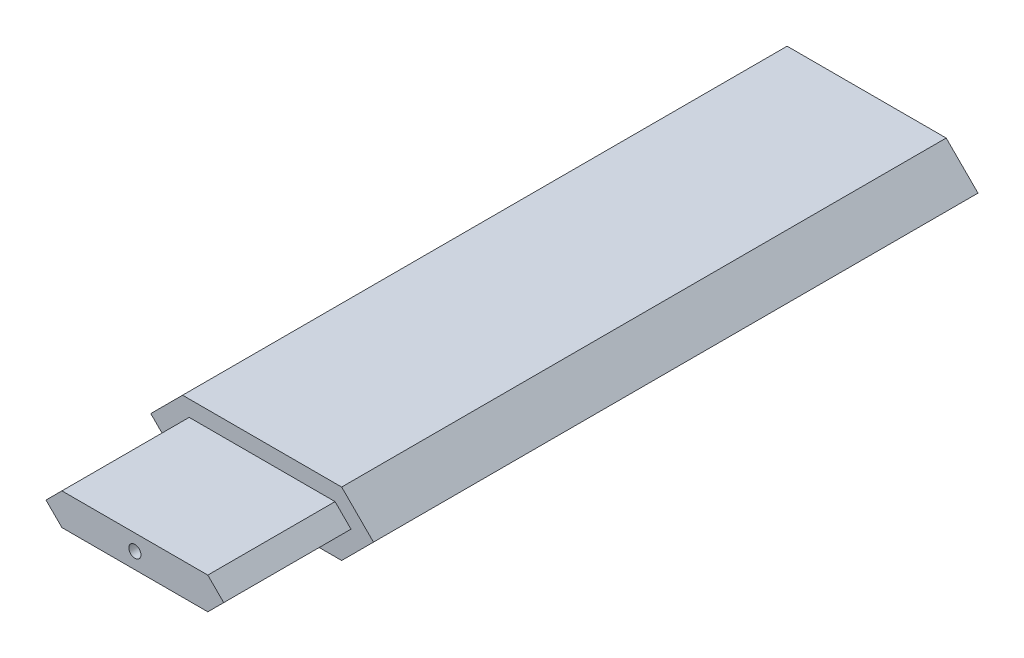
ISO-10303-21;
HEADER;
FILE_DESCRIPTION(('STEP AP214'),'2;1');
FILE_NAME('part.step','',(''),(''),'','','');
FILE_SCHEMA(('AUTOMOTIVE_DESIGN { 1 0 10303 214 1 1 1 1 }'));
ENDSEC;
DATA;
#1=APPLICATION_CONTEXT('core data for automotive mechanical design processes');
#2=APPLICATION_PROTOCOL_DEFINITION('international standard','automotive_design',2000,#1);
#3=PRODUCT_CONTEXT('',#1,'mechanical');
#4=PRODUCT('Part','Part','',(#3));
#5=PRODUCT_RELATED_PRODUCT_CATEGORY('part','',(#4));
#6=PRODUCT_DEFINITION_FORMATION('','',#4);
#7=PRODUCT_DEFINITION_CONTEXT('part definition',#1,'design');
#8=PRODUCT_DEFINITION('design','',#6,#7);
#9=PRODUCT_DEFINITION_SHAPE('','',#8);
#10=(LENGTH_UNIT() NAMED_UNIT(*) SI_UNIT(.MILLI.,.METRE.));
#11=(NAMED_UNIT(*) PLANE_ANGLE_UNIT() SI_UNIT($,.RADIAN.));
#12=(NAMED_UNIT(*) SI_UNIT($,.STERADIAN.) SOLID_ANGLE_UNIT());
#13=UNCERTAINTY_MEASURE_WITH_UNIT(LENGTH_MEASURE(1.E-05),#10,'distance_accuracy_value','');
#14=(GEOMETRIC_REPRESENTATION_CONTEXT(3) GLOBAL_UNCERTAINTY_ASSIGNED_CONTEXT((#13)) GLOBAL_UNIT_ASSIGNED_CONTEXT((#10,
#11,#12)) REPRESENTATION_CONTEXT('',''));
#15=CARTESIAN_POINT('',(0.,0.,0.));
#16=DIRECTION('',(0.,0.,1.));
#17=DIRECTION('',(1.,0.,0.));
#18=AXIS2_PLACEMENT_3D('',#15,#16,#17);
#19=CARTESIAN_POINT('',(0.,0.,-575.0001));
#20=DIRECTION('',(0.,0.,1.));
#21=DIRECTION('',(1.,0.,0.));
#22=AXIS2_PLACEMENT_3D('',#19,#20,#21);
#23=CYLINDRICAL_SURFACE('',#22,1.9);
#24=CARTESIAN_POINT('',(0.,0.,-345.));
#25=DIRECTION('',(0.,0.,1.));
#26=DIRECTION('',(1.,0.,0.));
#27=AXIS2_PLACEMENT_3D('',#24,#25,#26);
#28=CIRCLE('',#27,1.9);
#29=CARTESIAN_POINT('',(1.9,0.,-345.));
#30=VERTEX_POINT('',#29);
#31=EDGE_CURVE('E367',#30,#30,#28,.T.);
#32=ORIENTED_EDGE('',*,*,#31,.T.);
#33=EDGE_LOOP('',(#32));
#34=FACE_BOUND('',#33,.T.);
#35=CARTESIAN_POINT('',(0.,0.,-534.));
#36=DIRECTION('',(0.,0.,-1.));
#37=DIRECTION('',(-1.,0.,0.));
#38=AXIS2_PLACEMENT_3D('',#35,#36,#37);
#39=CIRCLE('',#38,1.9);
#40=CARTESIAN_POINT('',(-1.9,0.,-534.));
#41=VERTEX_POINT('',#40);
#42=EDGE_CURVE('E120',#41,#41,#39,.F.);
#43=ORIENTED_EDGE('',*,*,#42,.F.);
#44=EDGE_LOOP('',(#43));
#45=FACE_BOUND('',#44,.T.);
#46=ADVANCED_FACE('F115',(#34,#45),#23,.F.);
#47=CARTESIAN_POINT('',(17.5,-17.5,0.));
#48=DIRECTION('',(0.707106781186548,-0.707106781186547,0.));
#49=DIRECTION('',(-0.707106781186547,-0.707106781186548,0.));
#50=AXIS2_PLACEMENT_3D('',#47,#48,#49);
#51=PLANE('',#50);
#52=DIRECTION('',(0.,0.,-1.));
#53=VECTOR('',#52,1.);
#54=CARTESIAN_POINT('',(35.,0.,0.));
#55=LINE('',#54,#53);
#56=CARTESIAN_POINT('',(35.,0.,-385.));
#57=VERTEX_POINT('',#56);
#58=CARTESIAN_POINT('',(35.,0.,-575.));
#59=VERTEX_POINT('',#58);
#60=EDGE_CURVE('E484',#57,#59,#55,.T.);
#61=ORIENTED_EDGE('',*,*,#60,.F.);
#62=DIRECTION('',(-0.707106781186547,-0.707106781186548,0.));
#63=VECTOR('',#62,1.);
#64=CARTESIAN_POINT('',(17.5,-17.5,-385.));
#65=LINE('',#64,#63);
#66=CARTESIAN_POINT('',(25.,-10.,-385.));
#67=VERTEX_POINT('',#66);
#68=EDGE_CURVE('E357',#57,#67,#65,.T.);
#69=ORIENTED_EDGE('',*,*,#68,.T.);
#70=CARTESIAN_POINT('',(25.,-10.,-385.));
#71=DIRECTION('',(0.,0.,-1.));
#72=VECTOR('',#71,1.);
#73=LINE('',#70,#72);
#74=CARTESIAN_POINT('',(25.,-10.,-575.));
#75=VERTEX_POINT('',#74);
#76=EDGE_CURVE('E395',#67,#75,#73,.T.);
#77=ORIENTED_EDGE('',*,*,#76,.T.);
#78=DIRECTION('',(-0.707106781186547,-0.707106781186548,0.));
#79=VECTOR('',#78,1.);
#80=CARTESIAN_POINT('',(17.5,-17.5,-575.));
#81=LINE('',#80,#79);
#82=EDGE_CURVE('E385',#59,#75,#81,.T.);
#83=ORIENTED_EDGE('',*,*,#82,.F.);
#84=EDGE_LOOP('',(#61,#69,#77,#83));
#85=FACE_BOUND('',#84,.T.);
#86=ADVANCED_FACE('F417',(#85),#51,.T.);
#87=CARTESIAN_POINT('',(-17.5,-17.5,0.));
#88=DIRECTION('',(-0.707106781186548,-0.707106781186547,0.));
#89=DIRECTION('',(-0.707106781186547,0.707106781186548,0.));
#90=AXIS2_PLACEMENT_3D('',#87,#88,#89);
#91=PLANE('',#90);
#92=CARTESIAN_POINT('',(-25.,-10.,-575.));
#93=DIRECTION('',(0.,0.,1.));
#94=VECTOR('',#93,1.);
#95=LINE('',#92,#94);
#96=CARTESIAN_POINT('',(-25.,-10.,-575.));
#97=VERTEX_POINT('',#96);
#98=CARTESIAN_POINT('',(-25.,-10.,-385.));
#99=VERTEX_POINT('',#98);
#100=EDGE_CURVE('E494',#97,#99,#95,.T.);
#101=ORIENTED_EDGE('',*,*,#100,.T.);
#102=DIRECTION('',(-0.707106781186547,0.707106781186548,0.));
#103=VECTOR('',#102,1.);
#104=CARTESIAN_POINT('',(-17.5,-17.5,-385.));
#105=LINE('',#104,#103);
#106=CARTESIAN_POINT('',(-35.,0.,-385.));
#107=VERTEX_POINT('',#106);
#108=EDGE_CURVE('E352',#99,#107,#105,.T.);
#109=ORIENTED_EDGE('',*,*,#108,.T.);
#110=DIRECTION('',(0.,0.,1.));
#111=VECTOR('',#110,1.);
#112=CARTESIAN_POINT('',(-35.,0.,0.));
#113=LINE('',#112,#111);
#114=CARTESIAN_POINT('',(-35.,0.,-575.));
#115=VERTEX_POINT('',#114);
#116=EDGE_CURVE('E486',#115,#107,#113,.T.);
#117=ORIENTED_EDGE('',*,*,#116,.F.);
#118=DIRECTION('',(-0.707106781186547,0.707106781186548,0.));
#119=VECTOR('',#118,1.);
#120=CARTESIAN_POINT('',(-17.5,-17.5,-575.));
#121=LINE('',#120,#119);
#122=EDGE_CURVE('E380',#97,#115,#121,.T.);
#123=ORIENTED_EDGE('',*,*,#122,.F.);
#124=EDGE_LOOP('',(#101,#109,#117,#123));
#125=FACE_BOUND('',#124,.T.);
#126=ADVANCED_FACE('F407',(#125),#91,.T.);
#127=CARTESIAN_POINT('',(0.,-10.,0.));
#128=DIRECTION('',(0.,-1.,0.));
#129=DIRECTION('',(0.,0.,1.));
#130=AXIS2_PLACEMENT_3D('',#127,#128,#129);
#131=PLANE('',#130);
#132=ORIENTED_EDGE('',*,*,#76,.F.);
#133=DIRECTION('',(-1.,0.,0.));
#134=VECTOR('',#133,1.);
#135=CARTESIAN_POINT('',(0.,-10.,-385.));
#136=LINE('',#135,#134);
#137=EDGE_CURVE('E362',#67,#99,#136,.T.);
#138=ORIENTED_EDGE('',*,*,#137,.T.);
#139=ORIENTED_EDGE('',*,*,#100,.F.);
#140=DIRECTION('',(-1.,0.,0.));
#141=VECTOR('',#140,1.);
#142=CARTESIAN_POINT('',(0.,-10.,-575.));
#143=LINE('',#142,#141);
#144=EDGE_CURVE('E390',#75,#97,#143,.T.);
#145=ORIENTED_EDGE('',*,*,#144,.F.);
#146=EDGE_LOOP('',(#132,#138,#139,#145));
#147=FACE_BOUND('',#146,.T.);
#148=ADVANCED_FACE('F416',(#147),#131,.T.);
#149=CARTESIAN_POINT('',(-17.5,17.5,0.));
#150=DIRECTION('',(-0.707106781186548,0.707106781186547,0.));
#151=DIRECTION('',(-0.707106781186547,-0.707106781186548,0.));
#152=AXIS2_PLACEMENT_3D('',#149,#150,#151);
#153=PLANE('',#152);
#154=ORIENTED_EDGE('',*,*,#116,.T.);
#155=DIRECTION('',(0.707106781186547,0.707106781186548,0.));
#156=VECTOR('',#155,1.);
#157=CARTESIAN_POINT('',(-17.5,17.5,-385.));
#158=LINE('',#157,#156);
#159=CARTESIAN_POINT('',(-25.,10.,-385.));
#160=VERTEX_POINT('',#159);
#161=EDGE_CURVE('E347',#107,#160,#158,.T.);
#162=ORIENTED_EDGE('',*,*,#161,.T.);
#163=DIRECTION('',(0.,0.,1.));
#164=VECTOR('',#163,1.);
#165=CARTESIAN_POINT('',(-25.,10.,0.));
#166=LINE('',#165,#164);
#167=CARTESIAN_POINT('',(-25.,10.,-575.));
#168=VERTEX_POINT('',#167);
#169=EDGE_CURVE('E449',#168,#160,#166,.T.);
#170=ORIENTED_EDGE('',*,*,#169,.F.);
#171=DIRECTION('',(0.707106781186547,0.707106781186548,0.));
#172=VECTOR('',#171,1.);
#173=CARTESIAN_POINT('',(-17.5,17.5,-575.));
#174=LINE('',#173,#172);
#175=EDGE_CURVE('E375',#115,#168,#174,.T.);
#176=ORIENTED_EDGE('',*,*,#175,.F.);
#177=EDGE_LOOP('',(#154,#162,#170,#176));
#178=FACE_BOUND('',#177,.T.);
#179=ADVANCED_FACE('F117',(#178),#153,.T.);
#180=CARTESIAN_POINT('',(17.5,17.5,0.));
#181=DIRECTION('',(0.707106781186548,0.707106781186547,0.));
#182=DIRECTION('',(-0.707106781186547,0.707106781186548,0.));
#183=AXIS2_PLACEMENT_3D('',#180,#181,#182);
#184=PLANE('',#183);
#185=DIRECTION('',(0.,0.,-1.));
#186=VECTOR('',#185,1.);
#187=CARTESIAN_POINT('',(25.,10.,0.));
#188=LINE('',#187,#186);
#189=CARTESIAN_POINT('',(25.,10.,-385.));
#190=VERTEX_POINT('',#189);
#191=CARTESIAN_POINT('',(25.,10.,-575.));
#192=VERTEX_POINT('',#191);
#193=EDGE_CURVE('E479',#190,#192,#188,.T.);
#194=ORIENTED_EDGE('',*,*,#193,.F.);
#195=DIRECTION('',(0.707106781186547,-0.707106781186548,0.));
#196=VECTOR('',#195,1.);
#197=CARTESIAN_POINT('',(17.5,17.5,-385.));
#198=LINE('',#197,#196);
#199=EDGE_CURVE('E141',#190,#57,#198,.T.);
#200=ORIENTED_EDGE('',*,*,#199,.T.);
#201=ORIENTED_EDGE('',*,*,#60,.T.);
#202=DIRECTION('',(0.707106781186547,-0.707106781186548,0.));
#203=VECTOR('',#202,1.);
#204=CARTESIAN_POINT('',(17.5,17.5,-575.));
#205=LINE('',#204,#203);
#206=EDGE_CURVE('E372',#192,#59,#205,.T.);
#207=ORIENTED_EDGE('',*,*,#206,.F.);
#208=EDGE_LOOP('',(#194,#200,#201,#207));
#209=FACE_BOUND('',#208,.T.);
#210=ADVANCED_FACE('F425',(#209),#184,.T.);
#211=CARTESIAN_POINT('',(0.,10.,0.));
#212=DIRECTION('',(0.,1.,0.));
#213=DIRECTION('',(0.,0.,1.));
#214=AXIS2_PLACEMENT_3D('',#211,#212,#213);
#215=PLANE('',#214);
#216=ORIENTED_EDGE('',*,*,#169,.T.);
#217=DIRECTION('',(1.,0.,0.));
#218=VECTOR('',#217,1.);
#219=CARTESIAN_POINT('',(0.,10.,-385.));
#220=LINE('',#219,#218);
#221=EDGE_CURVE('E13',#160,#190,#220,.T.);
#222=ORIENTED_EDGE('',*,*,#221,.T.);
#223=ORIENTED_EDGE('',*,*,#193,.T.);
#224=DIRECTION('',(1.,0.,0.));
#225=VECTOR('',#224,1.);
#226=CARTESIAN_POINT('',(0.,10.,-575.));
#227=LINE('',#226,#225);
#228=EDGE_CURVE('E125',#168,#192,#227,.T.);
#229=ORIENTED_EDGE('',*,*,#228,.F.);
#230=EDGE_LOOP('',(#216,#222,#223,#229));
#231=FACE_BOUND('',#230,.T.);
#232=ADVANCED_FACE('F421',(#231),#215,.T.);
#233=CARTESIAN_POINT('',(0.,-22.5001,-345.));
#234=DIRECTION('',(0.,0.,1.));
#235=DIRECTION('',(1.,0.,0.));
#236=AXIS2_PLACEMENT_3D('',#233,#234,#235);
#237=PLANE('',#236);
#238=ORIENTED_EDGE('',*,*,#31,.F.);
#239=EDGE_LOOP('',(#238));
#240=FACE_BOUND('',#239,.T.);
#241=DIRECTION('',(-0.707106781186547,-0.707106781186548,0.));
#242=VECTOR('',#241,1.);
#243=CARTESIAN_POINT('',(-22.9289321881345,5.,-345.));
#244=LINE('',#243,#242);
#245=CARTESIAN_POINT('',(-22.9289321881345,5.,-345.));
#246=VERTEX_POINT('',#245);
#247=CARTESIAN_POINT('',(-27.9289321881345,0.,-345.));
#248=VERTEX_POINT('',#247);
#249=EDGE_CURVE('E301',#246,#248,#244,.T.);
#250=ORIENTED_EDGE('',*,*,#249,.T.);
#251=DIRECTION('',(0.707106781186548,-0.707106781186548,0.));
#252=VECTOR('',#251,1.);
#253=CARTESIAN_POINT('',(-27.9289321881345,0.,-345.));
#254=LINE('',#253,#252);
#255=CARTESIAN_POINT('',(-22.9289321881345,-5.,-345.));
#256=VERTEX_POINT('',#255);
#257=EDGE_CURVE('E317',#248,#256,#254,.T.);
#258=ORIENTED_EDGE('',*,*,#257,.T.);
#259=DIRECTION('',(1.,0.,0.));
#260=VECTOR('',#259,1.);
#261=CARTESIAN_POINT('',(-22.9289321881345,-5.,-345.));
#262=LINE('',#261,#260);
#263=CARTESIAN_POINT('',(22.9289321881345,-5.,-345.));
#264=VERTEX_POINT('',#263);
#265=EDGE_CURVE('E320',#256,#264,#262,.T.);
#266=ORIENTED_EDGE('',*,*,#265,.T.);
#267=DIRECTION('',(0.707106781186547,0.707106781186548,0.));
#268=VECTOR('',#267,1.);
#269=CARTESIAN_POINT('',(22.9289321881345,-5.,-345.));
#270=LINE('',#269,#268);
#271=CARTESIAN_POINT('',(27.9289321881345,0.,-345.));
#272=VERTEX_POINT('',#271);
#273=EDGE_CURVE('E323',#264,#272,#270,.T.);
#274=ORIENTED_EDGE('',*,*,#273,.T.);
#275=DIRECTION('',(-0.707106781186547,0.707106781186548,0.));
#276=VECTOR('',#275,1.);
#277=CARTESIAN_POINT('',(27.9289321881345,0.,-345.));
#278=LINE('',#277,#276);
#279=CARTESIAN_POINT('',(22.9289321881345,5.,-345.));
#280=VERTEX_POINT('',#279);
#281=EDGE_CURVE('E326',#272,#280,#278,.T.);
#282=ORIENTED_EDGE('',*,*,#281,.T.);
#283=DIRECTION('',(-1.,0.,0.));
#284=VECTOR('',#283,1.);
#285=CARTESIAN_POINT('',(22.9289321881345,5.,-345.));
#286=LINE('',#285,#284);
#287=EDGE_CURVE('E329',#280,#246,#286,.T.);
#288=ORIENTED_EDGE('',*,*,#287,.T.);
#289=EDGE_LOOP('',(#250,#258,#266,#274,#282,#288));
#290=FACE_BOUND('',#289,.T.);
#291=ADVANCED_FACE('F424',(#240,#290),#237,.T.);
#292=CARTESIAN_POINT('',(0.,-22.5001,-575.));
#293=DIRECTION('',(0.,0.,1.));
#294=DIRECTION('',(1.,0.,0.));
#295=AXIS2_PLACEMENT_3D('',#292,#293,#294);
#296=PLANE('',#295);
#297=DIRECTION('',(-0.707106781186547,-0.707106781186548,0.));
#298=VECTOR('',#297,1.);
#299=CARTESIAN_POINT('',(28.2117749006091,0.,-575.));
#300=LINE('',#299,#298);
#301=CARTESIAN_POINT('',(28.2117749006091,0.,-575.));
#302=VERTEX_POINT('',#301);
#303=CARTESIAN_POINT('',(23.0117749006092,-5.2,-575.));
#304=VERTEX_POINT('',#303);
#305=EDGE_CURVE('E278',#302,#304,#300,.T.);
#306=ORIENTED_EDGE('',*,*,#305,.F.);
#307=DIRECTION('',(0.707106781186547,-0.707106781186548,0.));
#308=VECTOR('',#307,1.);
#309=CARTESIAN_POINT('',(23.0117749006092,5.2,-575.));
#310=LINE('',#309,#308);
#311=CARTESIAN_POINT('',(23.0117749006092,5.2,-575.));
#312=VERTEX_POINT('',#311);
#313=EDGE_CURVE('E133',#312,#302,#310,.T.);
#314=ORIENTED_EDGE('',*,*,#313,.F.);
#315=DIRECTION('',(1.,0.,0.));
#316=VECTOR('',#315,1.);
#317=CARTESIAN_POINT('',(-23.0117749006092,5.2,-575.));
#318=LINE('',#317,#316);
#319=CARTESIAN_POINT('',(-23.0117749006092,5.2,-575.));
#320=VERTEX_POINT('',#319);
#321=EDGE_CURVE('E264',#320,#312,#318,.T.);
#322=ORIENTED_EDGE('',*,*,#321,.F.);
#323=DIRECTION('',(0.707106781186548,0.707106781186547,0.));
#324=VECTOR('',#323,1.);
#325=CARTESIAN_POINT('',(-28.2117749006092,0.,-575.));
#326=LINE('',#325,#324);
#327=CARTESIAN_POINT('',(-28.2117749006092,0.,-575.));
#328=VERTEX_POINT('',#327);
#329=EDGE_CURVE('E267',#328,#320,#326,.T.);
#330=ORIENTED_EDGE('',*,*,#329,.F.);
#331=DIRECTION('',(-0.707106781186548,0.707106781186548,0.));
#332=VECTOR('',#331,1.);
#333=CARTESIAN_POINT('',(-23.0117749006092,-5.2,-575.));
#334=LINE('',#333,#332);
#335=CARTESIAN_POINT('',(-23.0117749006092,-5.2,-575.));
#336=VERTEX_POINT('',#335);
#337=EDGE_CURVE('E283',#336,#328,#334,.T.);
#338=ORIENTED_EDGE('',*,*,#337,.F.);
#339=DIRECTION('',(-1.,0.,0.));
#340=VECTOR('',#339,1.);
#341=CARTESIAN_POINT('',(23.0117749006092,-5.2,-575.));
#342=LINE('',#341,#340);
#343=EDGE_CURVE('E280',#304,#336,#342,.T.);
#344=ORIENTED_EDGE('',*,*,#343,.F.);
#345=EDGE_LOOP('',(#306,#314,#322,#330,#338,#344));
#346=FACE_BOUND('',#345,.T.);
#347=ORIENTED_EDGE('',*,*,#82,.T.);
#348=ORIENTED_EDGE('',*,*,#144,.T.);
#349=ORIENTED_EDGE('',*,*,#122,.T.);
#350=ORIENTED_EDGE('',*,*,#175,.T.);
#351=ORIENTED_EDGE('',*,*,#228,.T.);
#352=ORIENTED_EDGE('',*,*,#206,.T.);
#353=EDGE_LOOP('',(#347,#348,#349,#350,#351,#352));
#354=FACE_BOUND('',#353,.T.);
#355=ADVANCED_FACE('F512',(#346,#354),#296,.F.);
#356=CARTESIAN_POINT('',(0.,0.,-385.));
#357=DIRECTION('',(0.,0.,1.));
#358=DIRECTION('',(1.,0.,0.));
#359=AXIS2_PLACEMENT_3D('',#356,#357,#358);
#360=PLANE('',#359);
#361=ORIENTED_EDGE('',*,*,#68,.F.);
#362=ORIENTED_EDGE('',*,*,#199,.F.);
#363=ORIENTED_EDGE('',*,*,#221,.F.);
#364=ORIENTED_EDGE('',*,*,#161,.F.);
#365=ORIENTED_EDGE('',*,*,#108,.F.);
#366=ORIENTED_EDGE('',*,*,#137,.F.);
#367=EDGE_LOOP('',(#361,#362,#363,#364,#365,#366));
#368=FACE_BOUND('',#367,.T.);
#369=DIRECTION('',(-0.707106781186547,-0.707106781186548,0.));
#370=VECTOR('',#369,1.);
#371=CARTESIAN_POINT('',(-22.9289321881345,5.,-385.));
#372=LINE('',#371,#370);
#373=CARTESIAN_POINT('',(-22.9289321881345,5.,-385.));
#374=VERTEX_POINT('',#373);
#375=CARTESIAN_POINT('',(-27.9289321881345,0.,-385.));
#376=VERTEX_POINT('',#375);
#377=EDGE_CURVE('E313',#374,#376,#372,.T.);
#378=ORIENTED_EDGE('',*,*,#377,.F.);
#379=DIRECTION('',(-1.,0.,0.));
#380=VECTOR('',#379,1.);
#381=CARTESIAN_POINT('',(22.9289321881345,5.,-385.));
#382=LINE('',#381,#380);
#383=CARTESIAN_POINT('',(22.9289321881345,5.,-385.));
#384=VERTEX_POINT('',#383);
#385=EDGE_CURVE('E310',#384,#374,#382,.T.);
#386=ORIENTED_EDGE('',*,*,#385,.F.);
#387=DIRECTION('',(-0.707106781186547,0.707106781186548,0.));
#388=VECTOR('',#387,1.);
#389=CARTESIAN_POINT('',(27.9289321881345,0.,-385.));
#390=LINE('',#389,#388);
#391=CARTESIAN_POINT('',(27.9289321881345,0.,-385.));
#392=VERTEX_POINT('',#391);
#393=EDGE_CURVE('E307',#392,#384,#390,.T.);
#394=ORIENTED_EDGE('',*,*,#393,.F.);
#395=DIRECTION('',(0.707106781186547,0.707106781186548,0.));
#396=VECTOR('',#395,1.);
#397=CARTESIAN_POINT('',(22.9289321881345,-5.,-385.));
#398=LINE('',#397,#396);
#399=CARTESIAN_POINT('',(22.9289321881345,-5.,-385.));
#400=VERTEX_POINT('',#399);
#401=EDGE_CURVE('E304',#400,#392,#398,.T.);
#402=ORIENTED_EDGE('',*,*,#401,.F.);
#403=DIRECTION('',(1.,0.,0.));
#404=VECTOR('',#403,1.);
#405=CARTESIAN_POINT('',(-22.9289321881345,-5.,-385.));
#406=LINE('',#405,#404);
#407=CARTESIAN_POINT('',(-22.9289321881345,-5.,-385.));
#408=VERTEX_POINT('',#407);
#409=EDGE_CURVE('E300',#408,#400,#406,.T.);
#410=ORIENTED_EDGE('',*,*,#409,.F.);
#411=DIRECTION('',(0.707106781186548,-0.707106781186548,0.));
#412=VECTOR('',#411,1.);
#413=CARTESIAN_POINT('',(-27.9289321881345,0.,-385.));
#414=LINE('',#413,#412);
#415=EDGE_CURVE('E297',#376,#408,#414,.T.);
#416=ORIENTED_EDGE('',*,*,#415,.F.);
#417=EDGE_LOOP('',(#378,#386,#394,#402,#410,#416));
#418=FACE_BOUND('',#417,.T.);
#419=ADVANCED_FACE('F516',(#368,#418),#360,.T.);
#420=CARTESIAN_POINT('',(-27.9289321881345,0.,-385.));
#421=DIRECTION('',(-0.707106781186548,-0.707106781186548,0.));
#422=DIRECTION('',(0.707106781186548,-0.707106781186548,0.));
#423=AXIS2_PLACEMENT_3D('',#420,#421,#422);
#424=PLANE('',#423);
#425=ORIENTED_EDGE('',*,*,#257,.F.);
#426=DIRECTION('',(0.,0.,1.));
#427=VECTOR('',#426,1.);
#428=CARTESIAN_POINT('',(-27.9289321881345,0.,-385.));
#429=LINE('',#428,#427);
#430=EDGE_CURVE('E334',#376,#248,#429,.T.);
#431=ORIENTED_EDGE('',*,*,#430,.F.);
#432=ORIENTED_EDGE('',*,*,#415,.T.);
#433=DIRECTION('',(0.,0.,1.));
#434=VECTOR('',#433,1.);
#435=CARTESIAN_POINT('',(-22.9289321881345,-5.,-385.));
#436=LINE('',#435,#434);
#437=EDGE_CURVE('E316',#408,#256,#436,.T.);
#438=ORIENTED_EDGE('',*,*,#437,.T.);
#439=EDGE_LOOP('',(#425,#431,#432,#438));
#440=FACE_BOUND('',#439,.T.);
#441=ADVANCED_FACE('F526',(#440),#424,.T.);
#442=CARTESIAN_POINT('',(-22.9289321881345,5.,-385.));
#443=DIRECTION('',(-0.707106781186548,0.707106781186547,0.));
#444=DIRECTION('',(-0.707106781186547,-0.707106781186548,0.));
#445=AXIS2_PLACEMENT_3D('',#442,#443,#444);
#446=PLANE('',#445);
#447=ORIENTED_EDGE('',*,*,#249,.F.);
#448=DIRECTION('',(0.,0.,1.));
#449=VECTOR('',#448,1.);
#450=CARTESIAN_POINT('',(-22.9289321881345,5.,-385.));
#451=LINE('',#450,#449);
#452=EDGE_CURVE('E336',#374,#246,#451,.T.);
#453=ORIENTED_EDGE('',*,*,#452,.F.);
#454=ORIENTED_EDGE('',*,*,#377,.T.);
#455=ORIENTED_EDGE('',*,*,#430,.T.);
#456=EDGE_LOOP('',(#447,#453,#454,#455));
#457=FACE_BOUND('',#456,.T.);
#458=ADVANCED_FACE('F529',(#457),#446,.T.);
#459=CARTESIAN_POINT('',(22.9289321881345,5.,-385.));
#460=DIRECTION('',(0.,1.,0.));
#461=DIRECTION('',(-1.,0.,0.));
#462=AXIS2_PLACEMENT_3D('',#459,#460,#461);
#463=PLANE('',#462);
#464=ORIENTED_EDGE('',*,*,#287,.F.);
#465=DIRECTION('',(0.,0.,1.));
#466=VECTOR('',#465,1.);
#467=CARTESIAN_POINT('',(22.9289321881345,5.,-385.));
#468=LINE('',#467,#466);
#469=EDGE_CURVE('E338',#384,#280,#468,.T.);
#470=ORIENTED_EDGE('',*,*,#469,.F.);
#471=ORIENTED_EDGE('',*,*,#385,.T.);
#472=ORIENTED_EDGE('',*,*,#452,.T.);
#473=EDGE_LOOP('',(#464,#470,#471,#472));
#474=FACE_BOUND('',#473,.T.);
#475=ADVANCED_FACE('F542',(#474),#463,.T.);
#476=CARTESIAN_POINT('',(27.9289321881345,0.,-385.));
#477=DIRECTION('',(0.707106781186548,0.707106781186547,0.));
#478=DIRECTION('',(-0.707106781186547,0.707106781186548,0.));
#479=AXIS2_PLACEMENT_3D('',#476,#477,#478);
#480=PLANE('',#479);
#481=ORIENTED_EDGE('',*,*,#281,.F.);
#482=DIRECTION('',(0.,0.,1.));
#483=VECTOR('',#482,1.);
#484=CARTESIAN_POINT('',(27.9289321881345,0.,-385.));
#485=LINE('',#484,#483);
#486=EDGE_CURVE('E340',#392,#272,#485,.T.);
#487=ORIENTED_EDGE('',*,*,#486,.F.);
#488=ORIENTED_EDGE('',*,*,#393,.T.);
#489=ORIENTED_EDGE('',*,*,#469,.T.);
#490=EDGE_LOOP('',(#481,#487,#488,#489));
#491=FACE_BOUND('',#490,.T.);
#492=ADVANCED_FACE('F538',(#491),#480,.T.);
#493=CARTESIAN_POINT('',(22.9289321881345,-5.,-385.));
#494=DIRECTION('',(0.707106781186548,-0.707106781186547,0.));
#495=DIRECTION('',(0.707106781186547,0.707106781186548,0.));
#496=AXIS2_PLACEMENT_3D('',#493,#494,#495);
#497=PLANE('',#496);
#498=ORIENTED_EDGE('',*,*,#273,.F.);
#499=DIRECTION('',(0.,0.,1.));
#500=VECTOR('',#499,1.);
#501=CARTESIAN_POINT('',(22.9289321881345,-5.,-385.));
#502=LINE('',#501,#500);
#503=EDGE_CURVE('E342',#400,#264,#502,.T.);
#504=ORIENTED_EDGE('',*,*,#503,.F.);
#505=ORIENTED_EDGE('',*,*,#401,.T.);
#506=ORIENTED_EDGE('',*,*,#486,.T.);
#507=EDGE_LOOP('',(#498,#504,#505,#506));
#508=FACE_BOUND('',#507,.T.);
#509=ADVANCED_FACE('F534',(#508),#497,.T.);
#510=CARTESIAN_POINT('',(-22.9289321881345,-5.,-385.));
#511=DIRECTION('',(0.,-1.,0.));
#512=DIRECTION('',(1.,0.,0.));
#513=AXIS2_PLACEMENT_3D('',#510,#511,#512);
#514=PLANE('',#513);
#515=ORIENTED_EDGE('',*,*,#265,.F.);
#516=ORIENTED_EDGE('',*,*,#437,.F.);
#517=ORIENTED_EDGE('',*,*,#409,.T.);
#518=ORIENTED_EDGE('',*,*,#503,.T.);
#519=EDGE_LOOP('',(#515,#516,#517,#518));
#520=FACE_BOUND('',#519,.T.);
#521=ADVANCED_FACE('F531',(#520),#514,.T.);
#522=CARTESIAN_POINT('',(0.,0.,-534.));
#523=DIRECTION('',(0.,0.,-1.));
#524=DIRECTION('',(-1.,0.,0.));
#525=AXIS2_PLACEMENT_3D('',#522,#523,#524);
#526=PLANE('',#525);
#527=DIRECTION('',(0.707106781186547,-0.707106781186548,0.));
#528=VECTOR('',#527,1.);
#529=CARTESIAN_POINT('',(23.0117749006092,5.2,-534.));
#530=LINE('',#529,#528);
#531=CARTESIAN_POINT('',(23.0117749006092,5.2,-534.));
#532=VERTEX_POINT('',#531);
#533=CARTESIAN_POINT('',(28.2117749006091,0.,-534.));
#534=VERTEX_POINT('',#533);
#535=EDGE_CURVE('E244',#532,#534,#530,.T.);
#536=ORIENTED_EDGE('',*,*,#535,.T.);
#537=DIRECTION('',(-0.707106781186547,-0.707106781186548,0.));
#538=VECTOR('',#537,1.);
#539=CARTESIAN_POINT('',(28.2117749006091,0.,-534.));
#540=LINE('',#539,#538);
#541=CARTESIAN_POINT('',(23.0117749006092,-5.2,-534.));
#542=VERTEX_POINT('',#541);
#543=EDGE_CURVE('E253',#534,#542,#540,.T.);
#544=ORIENTED_EDGE('',*,*,#543,.T.);
#545=DIRECTION('',(-1.,0.,0.));
#546=VECTOR('',#545,1.);
#547=CARTESIAN_POINT('',(23.0117749006092,-5.2,-534.));
#548=LINE('',#547,#546);
#549=CARTESIAN_POINT('',(-23.0117749006092,-5.2,-534.));
#550=VERTEX_POINT('',#549);
#551=EDGE_CURVE('E258',#542,#550,#548,.T.);
#552=ORIENTED_EDGE('',*,*,#551,.T.);
#553=DIRECTION('',(-0.707106781186548,0.707106781186548,0.));
#554=VECTOR('',#553,1.);
#555=CARTESIAN_POINT('',(-23.0117749006092,-5.2,-534.));
#556=LINE('',#555,#554);
#557=CARTESIAN_POINT('',(-28.2117749006092,0.,-534.));
#558=VERTEX_POINT('',#557);
#559=EDGE_CURVE('E271',#550,#558,#556,.T.);
#560=ORIENTED_EDGE('',*,*,#559,.T.);
#561=DIRECTION('',(0.707106781186548,0.707106781186547,0.));
#562=VECTOR('',#561,1.);
#563=CARTESIAN_POINT('',(-28.2117749006092,0.,-534.));
#564=LINE('',#563,#562);
#565=CARTESIAN_POINT('',(-23.0117749006092,5.2,-534.));
#566=VERTEX_POINT('',#565);
#567=EDGE_CURVE('E274',#558,#566,#564,.T.);
#568=ORIENTED_EDGE('',*,*,#567,.T.);
#569=DIRECTION('',(1.,0.,0.));
#570=VECTOR('',#569,1.);
#571=CARTESIAN_POINT('',(-23.0117749006092,5.2,-534.));
#572=LINE('',#571,#570);
#573=EDGE_CURVE('E250',#566,#532,#572,.T.);
#574=ORIENTED_EDGE('',*,*,#573,.T.);
#575=EDGE_LOOP('',(#536,#544,#552,#560,#568,#574));
#576=FACE_BOUND('',#575,.T.);
#577=ORIENTED_EDGE('',*,*,#42,.T.);
#578=EDGE_LOOP('',(#577));
#579=FACE_BOUND('',#578,.T.);
#580=ADVANCED_FACE('F260',(#576,#579),#526,.T.);
#581=CARTESIAN_POINT('',(23.0117749006092,5.2,-534.));
#582=DIRECTION('',(0.707106781186548,0.707106781186547,0.));
#583=DIRECTION('',(-0.707106781186547,0.707106781186548,0.));
#584=AXIS2_PLACEMENT_3D('',#581,#582,#583);
#585=PLANE('',#584);
#586=ORIENTED_EDGE('',*,*,#313,.T.);
#587=DIRECTION('',(0.,0.,-1.));
#588=VECTOR('',#587,1.);
#589=CARTESIAN_POINT('',(28.2117749006091,0.,-534.));
#590=LINE('',#589,#588);
#591=EDGE_CURVE('E240',#534,#302,#590,.T.);
#592=ORIENTED_EDGE('',*,*,#591,.F.);
#593=ORIENTED_EDGE('',*,*,#535,.F.);
#594=DIRECTION('',(0.,0.,-1.));
#595=VECTOR('',#594,1.);
#596=CARTESIAN_POINT('',(23.0117749006092,5.2,-534.));
#597=LINE('',#596,#595);
#598=EDGE_CURVE('E288',#532,#312,#597,.T.);
#599=ORIENTED_EDGE('',*,*,#598,.T.);
#600=EDGE_LOOP('',(#586,#592,#593,#599));
#601=FACE_BOUND('',#600,.T.);
#602=ADVANCED_FACE('F242',(#601),#585,.F.);
#603=CARTESIAN_POINT('',(-23.0117749006092,5.2,-534.));
#604=DIRECTION('',(0.,1.,0.));
#605=DIRECTION('',(-1.,0.,0.));
#606=AXIS2_PLACEMENT_3D('',#603,#604,#605);
#607=PLANE('',#606);
#608=ORIENTED_EDGE('',*,*,#321,.T.);
#609=ORIENTED_EDGE('',*,*,#598,.F.);
#610=ORIENTED_EDGE('',*,*,#573,.F.);
#611=DIRECTION('',(0.,0.,-1.));
#612=VECTOR('',#611,1.);
#613=CARTESIAN_POINT('',(-23.0117749006092,5.2,-534.));
#614=LINE('',#613,#612);
#615=EDGE_CURVE('E290',#566,#320,#614,.T.);
#616=ORIENTED_EDGE('',*,*,#615,.T.);
#617=EDGE_LOOP('',(#608,#609,#610,#616));
#618=FACE_BOUND('',#617,.T.);
#619=ADVANCED_FACE('F552',(#618),#607,.F.);
#620=CARTESIAN_POINT('',(-28.2117749006092,0.,-534.));
#621=DIRECTION('',(-0.707106781186547,0.707106781186548,0.));
#622=DIRECTION('',(-0.707106781186548,-0.707106781186547,0.));
#623=AXIS2_PLACEMENT_3D('',#620,#621,#622);
#624=PLANE('',#623);
#625=ORIENTED_EDGE('',*,*,#329,.T.);
#626=ORIENTED_EDGE('',*,*,#615,.F.);
#627=ORIENTED_EDGE('',*,*,#567,.F.);
#628=DIRECTION('',(0.,0.,-1.));
#629=VECTOR('',#628,1.);
#630=CARTESIAN_POINT('',(-28.2117749006092,0.,-534.));
#631=LINE('',#630,#629);
#632=EDGE_CURVE('E292',#558,#328,#631,.T.);
#633=ORIENTED_EDGE('',*,*,#632,.T.);
#634=EDGE_LOOP('',(#625,#626,#627,#633));
#635=FACE_BOUND('',#634,.T.);
#636=ADVANCED_FACE('F562',(#635),#624,.F.);
#637=CARTESIAN_POINT('',(-23.0117749006092,-5.2,-534.));
#638=DIRECTION('',(-0.707106781186547,-0.707106781186547,0.));
#639=DIRECTION('',(0.707106781186548,-0.707106781186548,0.));
#640=AXIS2_PLACEMENT_3D('',#637,#638,#639);
#641=PLANE('',#640);
#642=ORIENTED_EDGE('',*,*,#337,.T.);
#643=ORIENTED_EDGE('',*,*,#632,.F.);
#644=ORIENTED_EDGE('',*,*,#559,.F.);
#645=DIRECTION('',(0.,0.,-1.));
#646=VECTOR('',#645,1.);
#647=CARTESIAN_POINT('',(-23.0117749006092,-5.2,-534.));
#648=LINE('',#647,#646);
#649=EDGE_CURVE('E294',#550,#336,#648,.T.);
#650=ORIENTED_EDGE('',*,*,#649,.T.);
#651=EDGE_LOOP('',(#642,#643,#644,#650));
#652=FACE_BOUND('',#651,.T.);
#653=ADVANCED_FACE('F558',(#652),#641,.F.);
#654=CARTESIAN_POINT('',(23.0117749006092,-5.2,-534.));
#655=DIRECTION('',(0.,-1.,0.));
#656=DIRECTION('',(1.,0.,0.));
#657=AXIS2_PLACEMENT_3D('',#654,#655,#656);
#658=PLANE('',#657);
#659=ORIENTED_EDGE('',*,*,#343,.T.);
#660=ORIENTED_EDGE('',*,*,#649,.F.);
#661=ORIENTED_EDGE('',*,*,#551,.F.);
#662=DIRECTION('',(0.,0.,-1.));
#663=VECTOR('',#662,1.);
#664=CARTESIAN_POINT('',(23.0117749006092,-5.2,-534.));
#665=LINE('',#664,#663);
#666=EDGE_CURVE('E249',#542,#304,#665,.T.);
#667=ORIENTED_EDGE('',*,*,#666,.T.);
#668=EDGE_LOOP('',(#659,#660,#661,#667));
#669=FACE_BOUND('',#668,.T.);
#670=ADVANCED_FACE('F555',(#669),#658,.F.);
#671=CARTESIAN_POINT('',(28.2117749006091,0.,-534.));
#672=DIRECTION('',(0.707106781186548,-0.707106781186547,0.));
#673=DIRECTION('',(0.707106781186547,0.707106781186548,0.));
#674=AXIS2_PLACEMENT_3D('',#671,#672,#673);
#675=PLANE('',#674);
#676=ORIENTED_EDGE('',*,*,#305,.T.);
#677=ORIENTED_EDGE('',*,*,#666,.F.);
#678=ORIENTED_EDGE('',*,*,#543,.F.);
#679=ORIENTED_EDGE('',*,*,#591,.T.);
#680=EDGE_LOOP('',(#676,#677,#678,#679));
#681=FACE_BOUND('',#680,.T.);
#682=ADVANCED_FACE('F254',(#681),#675,.F.);
#683=CLOSED_SHELL('',(#46,#86,#126,#148,#179,#210,#232,#291,#355,#419,#441,#458,#475,#492,#509,
#521,#580,#602,#619,#636,#653,#670,#682));
#684=MANIFOLD_SOLID_BREP('B2',#683);
#685=ADVANCED_BREP_SHAPE_REPRESENTATION('',(#18,#684),#14);
#686=SHAPE_DEFINITION_REPRESENTATION(#9,#685);
ENDSEC;
END-ISO-10303-21;
